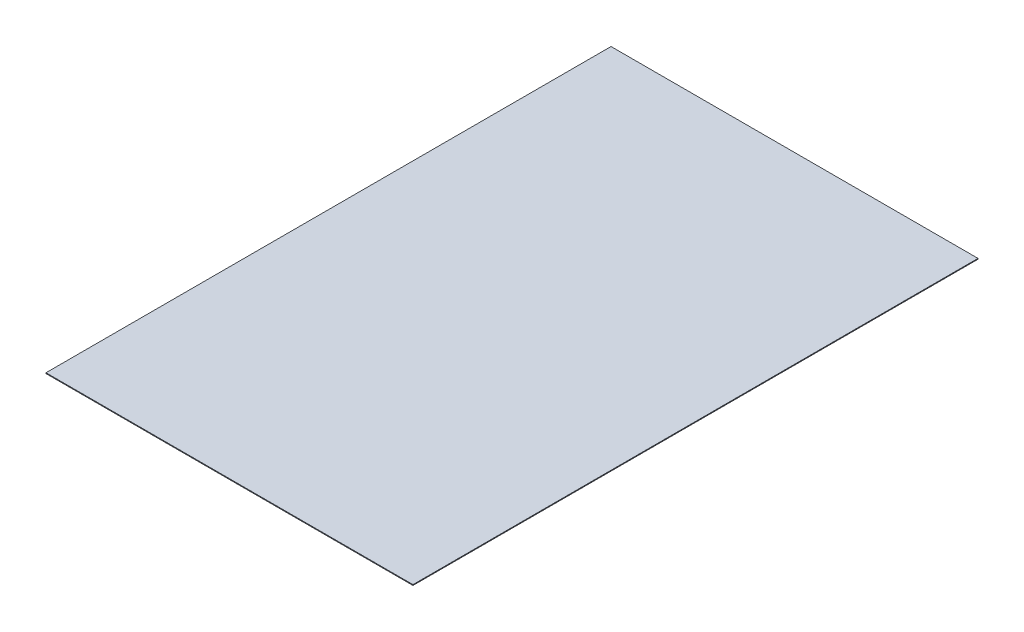
ISO-10303-21;
HEADER;
FILE_DESCRIPTION(('STEP AP214'),'2;1');
FILE_NAME('part.step','',(''),(''),'','','');
FILE_SCHEMA(('AUTOMOTIVE_DESIGN { 1 0 10303 214 1 1 1 1 }'));
ENDSEC;
DATA;
#1=APPLICATION_CONTEXT('core data for automotive mechanical design processes');
#2=APPLICATION_PROTOCOL_DEFINITION('international standard','automotive_design',2000,#1);
#3=PRODUCT_CONTEXT('',#1,'mechanical');
#4=PRODUCT('Part','Part','',(#3));
#5=PRODUCT_RELATED_PRODUCT_CATEGORY('part','',(#4));
#6=PRODUCT_DEFINITION_FORMATION('','',#4);
#7=PRODUCT_DEFINITION_CONTEXT('part definition',#1,'design');
#8=PRODUCT_DEFINITION('design','',#6,#7);
#9=PRODUCT_DEFINITION_SHAPE('','',#8);
#10=(LENGTH_UNIT() NAMED_UNIT(*) SI_UNIT(.MILLI.,.METRE.));
#11=(NAMED_UNIT(*) PLANE_ANGLE_UNIT() SI_UNIT($,.RADIAN.));
#12=(NAMED_UNIT(*) SI_UNIT($,.STERADIAN.) SOLID_ANGLE_UNIT());
#13=UNCERTAINTY_MEASURE_WITH_UNIT(LENGTH_MEASURE(1.E-05),#10,'distance_accuracy_value','');
#14=(GEOMETRIC_REPRESENTATION_CONTEXT(3) GLOBAL_UNCERTAINTY_ASSIGNED_CONTEXT((#13)) GLOBAL_UNIT_ASSIGNED_CONTEXT((#10,
#11,#12)) REPRESENTATION_CONTEXT('',''));
#15=CARTESIAN_POINT('',(0.,0.,0.));
#16=DIRECTION('',(0.,0.,1.));
#17=DIRECTION('',(1.,0.,0.));
#18=AXIS2_PLACEMENT_3D('',#15,#16,#17);
#19=CARTESIAN_POINT('',(0.,0.5,0.));
#20=DIRECTION('',(1.,0.,0.));
#21=DIRECTION('',(0.,0.,-1.));
#22=AXIS2_PLACEMENT_3D('',#19,#20,#21);
#23=PLANE('',#22);
#24=DIRECTION('',(0.,0.,1.));
#25=VECTOR('',#24,1.);
#26=CARTESIAN_POINT('',(0.,0.,0.));
#27=LINE('',#26,#25);
#28=CARTESIAN_POINT('',(0.,0.,-368.));
#29=VERTEX_POINT('',#28);
#30=CARTESIAN_POINT('',(0.,0.,0.));
#31=VERTEX_POINT('',#30);
#32=EDGE_CURVE('E99',#29,#31,#27,.T.);
#33=ORIENTED_EDGE('',*,*,#32,.T.);
#34=DIRECTION('',(0.,-1.,0.));
#35=VECTOR('',#34,1.);
#36=CARTESIAN_POINT('',(0.,0.5,0.));
#37=LINE('',#36,#35);
#38=CARTESIAN_POINT('',(0.,0.5,0.));
#39=VERTEX_POINT('',#38);
#40=EDGE_CURVE('E11',#39,#31,#37,.T.);
#41=ORIENTED_EDGE('',*,*,#40,.F.);
#42=DIRECTION('',(0.,0.,1.));
#43=VECTOR('',#42,1.);
#44=CARTESIAN_POINT('',(0.,0.5,0.));
#45=LINE('',#44,#43);
#46=CARTESIAN_POINT('',(0.,0.5,-368.));
#47=VERTEX_POINT('',#46);
#48=EDGE_CURVE('E87',#47,#39,#45,.T.);
#49=ORIENTED_EDGE('',*,*,#48,.F.);
#50=DIRECTION('',(0.,-1.,0.));
#51=VECTOR('',#50,1.);
#52=CARTESIAN_POINT('',(0.,0.5,-368.));
#53=LINE('',#52,#51);
#54=EDGE_CURVE('E95',#47,#29,#53,.T.);
#55=ORIENTED_EDGE('',*,*,#54,.T.);
#56=EDGE_LOOP('',(#33,#41,#49,#55));
#57=FACE_BOUND('',#56,.T.);
#58=ADVANCED_FACE('F36',(#57),#23,.F.);
#59=CARTESIAN_POINT('',(0.,0.5,0.));
#60=DIRECTION('',(0.,0.,-1.));
#61=DIRECTION('',(-1.,0.,0.));
#62=AXIS2_PLACEMENT_3D('',#59,#60,#61);
#63=PLANE('',#62);
#64=DIRECTION('',(1.,0.,0.));
#65=VECTOR('',#64,1.);
#66=CARTESIAN_POINT('',(0.,0.,0.));
#67=LINE('',#66,#65);
#68=CARTESIAN_POINT('',(239.,0.,0.));
#69=VERTEX_POINT('',#68);
#70=EDGE_CURVE('E91',#31,#69,#67,.T.);
#71=ORIENTED_EDGE('',*,*,#70,.T.);
#72=DIRECTION('',(0.,-1.,0.));
#73=VECTOR('',#72,1.);
#74=CARTESIAN_POINT('',(239.,0.5,0.));
#75=LINE('',#74,#73);
#76=CARTESIAN_POINT('',(239.,0.5,0.));
#77=VERTEX_POINT('',#76);
#78=EDGE_CURVE('E44',#77,#69,#75,.T.);
#79=ORIENTED_EDGE('',*,*,#78,.F.);
#80=DIRECTION('',(1.,0.,0.));
#81=VECTOR('',#80,1.);
#82=CARTESIAN_POINT('',(0.,0.5,0.));
#83=LINE('',#82,#81);
#84=EDGE_CURVE('E82',#39,#77,#83,.T.);
#85=ORIENTED_EDGE('',*,*,#84,.F.);
#86=ORIENTED_EDGE('',*,*,#40,.T.);
#87=EDGE_LOOP('',(#71,#79,#85,#86));
#88=FACE_BOUND('',#87,.T.);
#89=ADVANCED_FACE('F90',(#88),#63,.F.);
#90=CARTESIAN_POINT('',(239.,0.5,0.));
#91=DIRECTION('',(-1.,0.,0.));
#92=DIRECTION('',(0.,0.,1.));
#93=AXIS2_PLACEMENT_3D('',#90,#91,#92);
#94=PLANE('',#93);
#95=DIRECTION('',(0.,0.,-1.));
#96=VECTOR('',#95,1.);
#97=CARTESIAN_POINT('',(239.,0.,0.));
#98=LINE('',#97,#96);
#99=CARTESIAN_POINT('',(239.,0.,-368.));
#100=VERTEX_POINT('',#99);
#101=EDGE_CURVE('E69',#69,#100,#98,.T.);
#102=ORIENTED_EDGE('',*,*,#101,.T.);
#103=DIRECTION('',(0.,-1.,0.));
#104=VECTOR('',#103,1.);
#105=CARTESIAN_POINT('',(239.,0.5,-368.));
#106=LINE('',#105,#104);
#107=CARTESIAN_POINT('',(239.,0.5,-368.));
#108=VERTEX_POINT('',#107);
#109=EDGE_CURVE('E92',#108,#100,#106,.T.);
#110=ORIENTED_EDGE('',*,*,#109,.F.);
#111=DIRECTION('',(0.,0.,-1.));
#112=VECTOR('',#111,1.);
#113=CARTESIAN_POINT('',(239.,0.5,0.));
#114=LINE('',#113,#112);
#115=EDGE_CURVE('E85',#77,#108,#114,.T.);
#116=ORIENTED_EDGE('',*,*,#115,.F.);
#117=ORIENTED_EDGE('',*,*,#78,.T.);
#118=EDGE_LOOP('',(#102,#110,#116,#117));
#119=FACE_BOUND('',#118,.T.);
#120=ADVANCED_FACE('F93',(#119),#94,.F.);
#121=CARTESIAN_POINT('',(0.,0.5,-368.));
#122=DIRECTION('',(0.,0.,1.));
#123=DIRECTION('',(1.,0.,0.));
#124=AXIS2_PLACEMENT_3D('',#121,#122,#123);
#125=PLANE('',#124);
#126=DIRECTION('',(-1.,0.,0.));
#127=VECTOR('',#126,1.);
#128=CARTESIAN_POINT('',(0.,0.,-368.));
#129=LINE('',#128,#127);
#130=EDGE_CURVE('E75',#100,#29,#129,.T.);
#131=ORIENTED_EDGE('',*,*,#130,.T.);
#132=ORIENTED_EDGE('',*,*,#54,.F.);
#133=DIRECTION('',(-1.,0.,0.));
#134=VECTOR('',#133,1.);
#135=CARTESIAN_POINT('',(0.,0.5,-368.));
#136=LINE('',#135,#134);
#137=EDGE_CURVE('E52',#108,#47,#136,.T.);
#138=ORIENTED_EDGE('',*,*,#137,.F.);
#139=ORIENTED_EDGE('',*,*,#109,.T.);
#140=EDGE_LOOP('',(#131,#132,#138,#139));
#141=FACE_BOUND('',#140,.T.);
#142=ADVANCED_FACE('F106',(#141),#125,.F.);
#143=CARTESIAN_POINT('',(0.,0.5,0.));
#144=DIRECTION('',(0.,-1.,0.));
#145=DIRECTION('',(0.,0.,-1.));
#146=AXIS2_PLACEMENT_3D('',#143,#144,#145);
#147=PLANE('',#146);
#148=ORIENTED_EDGE('',*,*,#48,.T.);
#149=ORIENTED_EDGE('',*,*,#84,.T.);
#150=ORIENTED_EDGE('',*,*,#115,.T.);
#151=ORIENTED_EDGE('',*,*,#137,.T.);
#152=EDGE_LOOP('',(#148,#149,#150,#151));
#153=FACE_BOUND('',#152,.T.);
#154=ADVANCED_FACE('F83',(#153),#147,.F.);
#155=CARTESIAN_POINT('',(0.,0.,0.));
#156=DIRECTION('',(0.,-1.,0.));
#157=DIRECTION('',(0.,0.,-1.));
#158=AXIS2_PLACEMENT_3D('',#155,#156,#157);
#159=PLANE('',#158);
#160=ORIENTED_EDGE('',*,*,#32,.F.);
#161=ORIENTED_EDGE('',*,*,#130,.F.);
#162=ORIENTED_EDGE('',*,*,#101,.F.);
#163=ORIENTED_EDGE('',*,*,#70,.F.);
#164=EDGE_LOOP('',(#160,#161,#162,#163));
#165=FACE_BOUND('',#164,.T.);
#166=ADVANCED_FACE('F109',(#165),#159,.T.);
#167=CLOSED_SHELL('',(#58,#89,#120,#142,#154,#166));
#168=MANIFOLD_SOLID_BREP('B2',#167);
#169=ADVANCED_BREP_SHAPE_REPRESENTATION('',(#18,#168),#14);
#170=SHAPE_DEFINITION_REPRESENTATION(#9,#169);
ENDSEC;
END-ISO-10303-21;
